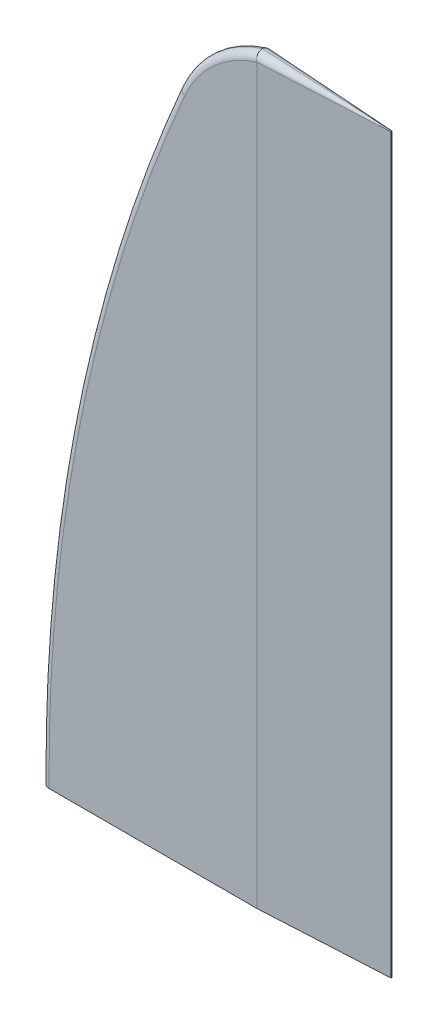
ISO-10303-21;
HEADER;
FILE_DESCRIPTION(('STEP AP214'),'2;1');
FILE_NAME('part.step','',(''),(''),'','','');
FILE_SCHEMA(('AUTOMOTIVE_DESIGN { 1 0 10303 214 1 1 1 1 }'));
ENDSEC;
DATA;
#1=APPLICATION_CONTEXT('core data for automotive mechanical design processes');
#2=APPLICATION_PROTOCOL_DEFINITION('international standard','automotive_design',2000,#1);
#3=PRODUCT_CONTEXT('',#1,'mechanical');
#4=PRODUCT('Part','Part','',(#3));
#5=PRODUCT_RELATED_PRODUCT_CATEGORY('part','',(#4));
#6=PRODUCT_DEFINITION_FORMATION('','',#4);
#7=PRODUCT_DEFINITION_CONTEXT('part definition',#1,'design');
#8=PRODUCT_DEFINITION('design','',#6,#7);
#9=PRODUCT_DEFINITION_SHAPE('','',#8);
#10=(LENGTH_UNIT() NAMED_UNIT(*) SI_UNIT(.MILLI.,.METRE.));
#11=(NAMED_UNIT(*) PLANE_ANGLE_UNIT() SI_UNIT($,.RADIAN.));
#12=(NAMED_UNIT(*) SI_UNIT($,.STERADIAN.) SOLID_ANGLE_UNIT());
#13=UNCERTAINTY_MEASURE_WITH_UNIT(LENGTH_MEASURE(1.E-05),#10,'distance_accuracy_value','');
#14=(GEOMETRIC_REPRESENTATION_CONTEXT(3) GLOBAL_UNCERTAINTY_ASSIGNED_CONTEXT((#13)) GLOBAL_UNIT_ASSIGNED_CONTEXT((#10,
#11,#12)) REPRESENTATION_CONTEXT('',''));
#15=CARTESIAN_POINT('',(0.,0.,0.));
#16=DIRECTION('',(0.,0.,1.));
#17=DIRECTION('',(1.,0.,0.));
#18=AXIS2_PLACEMENT_3D('',#15,#16,#17);
#19=CARTESIAN_POINT('',(-177.8,4.20738999196146E-12,7.62));
#20=DIRECTION('',(0.,1.,0.));
#21=DIRECTION('',(-1.,0.,0.));
#22=AXIS2_PLACEMENT_3D('',#19,#20,#21);
#23=PLANE('',#22);
#24=DIRECTION('',(1.,0.,0.));
#25=VECTOR('',#24,1.);
#26=CARTESIAN_POINT('',(-177.8,4.20738999196146E-12,0.));
#27=LINE('',#26,#25);
#28=CARTESIAN_POINT('',(-173.989872022617,4.11722860658388E-12,0.));
#29=VERTEX_POINT('',#28);
#30=CARTESIAN_POINT('',(-66.0399999999988,1.56274485415709E-12,0.));
#31=VERTEX_POINT('',#30);
#32=EDGE_CURVE('E103',#29,#31,#27,.T.);
#33=ORIENTED_EDGE('',*,*,#32,.T.);
#34=DIRECTION('',(-0.998553440723513,0.,-0.0537682621928045));
#35=VECTOR('',#34,1.);
#36=CARTESIAN_POINT('',(0.,0.,3.556));
#37=LINE('',#36,#35);
#38=CARTESIAN_POINT('',(0.,0.,3.556));
#39=VERTEX_POINT('',#38);
#40=EDGE_CURVE('E336',#31,#39,#37,.F.);
#41=ORIENTED_EDGE('',*,*,#40,.T.);
#42=DIRECTION('',(0.,0.,-1.));
#43=VECTOR('',#42,1.);
#44=CARTESIAN_POINT('',(0.,0.,7.62));
#45=LINE('',#44,#43);
#46=CARTESIAN_POINT('',(0.,0.,4.064));
#47=VERTEX_POINT('',#46);
#48=EDGE_CURVE('E318',#47,#39,#45,.T.);
#49=ORIENTED_EDGE('',*,*,#48,.F.);
#50=DIRECTION('',(-0.998553440723513,0.,0.0537682621928011));
#51=VECTOR('',#50,1.);
#52=CARTESIAN_POINT('',(-66.0400000000044,1.56211849011711E-12,7.62000000000001));
#53=LINE('',#52,#51);
#54=CARTESIAN_POINT('',(-66.0400000000134,1.56243167213738E-12,7.62000000000025));
#55=VERTEX_POINT('',#54);
#56=EDGE_CURVE('E333',#47,#55,#53,.T.);
#57=ORIENTED_EDGE('',*,*,#56,.T.);
#58=DIRECTION('',(1.,0.,0.));
#59=VECTOR('',#58,1.);
#60=CARTESIAN_POINT('',(-177.8,4.20738999196146E-12,7.62));
#61=LINE('',#60,#59);
#62=CARTESIAN_POINT('',(-173.989872022617,4.11722860658388E-12,7.62));
#63=VERTEX_POINT('',#62);
#64=EDGE_CURVE('E121',#63,#55,#61,.T.);
#65=ORIENTED_EDGE('',*,*,#64,.F.);
#66=CARTESIAN_POINT('',(-173.989872022617,4.11722860658388E-12,7.62));
#67=CARTESIAN_POINT('',(-174.097040658265,4.11976460291577E-12,7.62001026615399));
#68=CARTESIAN_POINT('',(-174.204204427978,4.12230048486555E-12,7.61547864249526));
#69=CARTESIAN_POINT('',(-174.417765249125,4.12735410569268E-12,7.59741106169239));
#70=CARTESIAN_POINT('',(-174.524162337038,4.12987184543324E-12,7.58387553585032));
#71=CARTESIAN_POINT('',(-174.735363523923,4.1348696280182E-12,7.54789316023985));
#72=CARTESIAN_POINT('',(-174.840168764086,4.1373496978681E-12,7.52545304083811));
#73=CARTESIAN_POINT('',(-175.047490781595,4.14225568500493E-12,7.47184346879641));
#74=CARTESIAN_POINT('',(-175.150007586889,4.14468160295324E-12,7.44067412283213));
#75=CARTESIAN_POINT('',(-175.453136235242,4.15185472143043E-12,7.33432396086146));
#76=CARTESIAN_POINT('',(-175.649412210338,4.15649931928596E-12,7.24628630802611));
#77=CARTESIAN_POINT('',(-176.024253328145,4.16536941347525E-12,7.03856648156611));
#78=CARTESIAN_POINT('',(-176.202821588502,4.16959498358366E-12,6.91888989199072));
#79=CARTESIAN_POINT('',(-176.537358105811,4.1775113258007E-12,6.65125105655382));
#80=CARTESIAN_POINT('',(-176.693326923372,4.18120211117537E-12,6.50328951254977));
#81=CARTESIAN_POINT('',(-176.978232650241,4.18794400940157E-12,6.18324922107158));
#82=CARTESIAN_POINT('',(-177.107164267177,4.19099499701647E-12,6.01116576285436));
#83=CARTESIAN_POINT('',(-177.33432125276,4.19637035119797E-12,5.64778260319904));
#84=CARTESIAN_POINT('',(-177.43254158394,4.19869459855986E-12,5.45647975606326));
#85=CARTESIAN_POINT('',(-177.595418517781,4.20254885450703E-12,5.06013701910691));
#86=CARTESIAN_POINT('',(-177.66009479702,4.20407932871107E-12,4.85510526240133));
#87=CARTESIAN_POINT('',(-177.737970735452,4.20592215623683E-12,4.50901509655985));
#88=CARTESIAN_POINT('',(-177.761217655541,4.20647226341714E-12,4.37013431403391));
#89=CARTESIAN_POINT('',(-177.792230251385,4.20720613419933E-12,4.09085509775485));
#90=CARTESIAN_POINT('',(-177.800017872046,4.20739041709898E-12,3.95045910014947));
#91=CARTESIAN_POINT('',(-177.8,4.20738999196146E-12,3.80999999999998));
#92=B_SPLINE_CURVE_WITH_KNOTS('',3,(#66,#67,#68,#69,#70,#71,#72,#73,#74,#75,#76,#77,#78,#79,#80,
#81,#82,#83,#84,#85,#86,#87,#88,#89,#90,#91),.UNSPECIFIED.,.F.,.F.,(4,2,2,2,2,2,2,2,2,2,2,2,4),
(0.,0.321401354796179,0.642787315035536,0.963930823125715,1.28507040684692,1.92709141648925,
2.56899918950943,3.21089103641919,3.85290841280215,4.49503104190702,5.13677658157781,
5.5584142509204,5.97945296461459),.UNSPECIFIED.);
#93=CARTESIAN_POINT('',(-177.8,4.58747623222067E-12,3.81));
#94=VERTEX_POINT('',#93);
#95=EDGE_CURVE('E107',#63,#94,#92,.T.);
#96=ORIENTED_EDGE('',*,*,#95,.T.);
#97=CARTESIAN_POINT('',(-177.8,4.58747623222067E-12,3.81));
#98=CARTESIAN_POINT('',(-177.800010270362,4.34389662516994E-12,3.70284019588339));
#99=CARTESIAN_POINT('',(-177.79547893166,4.24386223094728E-12,3.59568525983606));
#100=CARTESIAN_POINT('',(-177.777412514591,4.17027802432819E-12,3.38214208327815));
#101=CARTESIAN_POINT('',(-177.763877868714,4.196722136703E-12,3.27575380618796));
#102=CARTESIAN_POINT('',(-177.727897912471,4.21548945727429E-12,3.06457035707323));
#103=CARTESIAN_POINT('',(-177.705459348967,4.20783845592059E-12,2.95977404103903));
#104=CARTESIAN_POINT('',(-177.651853600446,4.20119870856618E-12,2.752469714012));
#105=CARTESIAN_POINT('',(-177.620686521871,4.20220985693843E-12,2.64996167513101));
#106=CARTESIAN_POINT('',(-177.514344382581,4.2025034555125E-12,2.34685912274692));
#107=CARTESIAN_POINT('',(-177.426313681498,4.19904907897616E-12,2.15060013572));
#108=CARTESIAN_POINT('',(-177.218611433984,4.19313046828321E-12,1.77579089396418));
#109=CARTESIAN_POINT('',(-177.098945453793,4.19066606013332E-12,1.59723753151644));
#110=CARTESIAN_POINT('',(-176.831327857749,4.18460216204715E-12,1.26272230043623));
#111=CARTESIAN_POINT('',(-176.683376099296,4.18100266638832E-12,1.10676054570542));
#112=CARTESIAN_POINT('',(-176.363357935547,4.1733578186659E-12,0.821865302954484));
#113=CARTESIAN_POINT('',(-176.191286817015,4.16931237949224E-12,0.692937109962573));
#114=CARTESIAN_POINT('',(-175.827918872688,4.16073308387637E-12,0.465774469146984));
#115=CARTESIAN_POINT('',(-175.636617687286,4.15619911666421E-12,0.367547002253029));
#116=CARTESIAN_POINT('',(-175.240277676309,4.14681515854244E-12,0.20465336212505));
#117=CARTESIAN_POINT('',(-175.035246970846,4.14196535447547E-12,0.139967545731322));
#118=CARTESIAN_POINT('',(-174.68911391424,4.13377558753369E-12,0.0620635394171811));
#119=CARTESIAN_POINT('',(-174.550188540623,4.13048791506955E-12,0.0388037746668039));
#120=CARTESIAN_POINT('',(-174.270818857961,4.12387662733918E-12,0.00777403518138521));
#121=CARTESIAN_POINT('',(-174.130376986876,4.12055306976329E-12,-1.78957540668996E-05));
#122=CARTESIAN_POINT('',(-173.989872022617,4.11722860658388E-12,0.));
#123=B_SPLINE_CURVE_WITH_KNOTS('',3,(#97,#98,#99,#100,#101,#102,#103,#104,#105,#106,#107,#108,
#109,#110,#111,#112,#113,#114,#115,#116,#117,#118,#119,#120,#121,#122),.UNSPECIFIED.,.F.,.F.,(4,
2,2,2,2,2,2,2,2,2,2,2,4),(0.,0.321374861150199,0.642734285636567,0.963850666595968,
1.28496313183881,1.92692948895154,2.56878296693516,3.21063968088234,3.85262199726322,
4.49475018571196,5.13650189558078,5.5582771813511,5.97945333839844),.UNSPECIFIED.);
#124=EDGE_CURVE('E101',#94,#29,#123,.T.);
#125=ORIENTED_EDGE('',*,*,#124,.T.);
#126=EDGE_LOOP('',(#33,#41,#49,#57,#65,#96,#125));
#127=FACE_BOUND('',#126,.T.);
#128=ADVANCED_FACE('F33',(#127),#23,.F.);
#129=CARTESIAN_POINT('',(0.,0.,7.62));
#130=DIRECTION('',(-1.,0.,0.));
#131=DIRECTION('',(0.,0.,1.));
#132=AXIS2_PLACEMENT_3D('',#129,#130,#131);
#133=PLANE('',#132);
#134=ORIENTED_EDGE('',*,*,#48,.T.);
#135=DIRECTION('',(0.,1.,0.));
#136=VECTOR('',#135,1.);
#137=CARTESIAN_POINT('',(0.,0.,3.556));
#138=LINE('',#137,#136);
#139=CARTESIAN_POINT('',(0.,380.673864339123,3.556));
#140=VERTEX_POINT('',#139);
#141=EDGE_CURVE('E275',#39,#140,#138,.T.);
#142=ORIENTED_EDGE('',*,*,#141,.T.);
#143=CARTESIAN_POINT('',(-5.87016179554537E-08,380.940339873911,3.81));
#144=CARTESIAN_POINT('',(-5.87016043855815E-08,380.940336035945,3.79296989406645));
#145=CARTESIAN_POINT('',(-5.86953716410879E-08,380.938559317114,3.77612475351803));
#146=CARTESIAN_POINT('',(-5.86766867696943E-08,380.933234310612,3.75110450372823));
#147=CARTESIAN_POINT('',(-5.86688369849191E-08,380.930997333708,3.74277995796682));
#148=CARTESIAN_POINT('',(-5.86501980588926E-08,380.92568647199,3.72648927831585));
#149=CARTESIAN_POINT('',(-5.86394113170854E-08,380.922613269396,3.71850240749036));
#150=CARTESIAN_POINT('',(-5.86148965002879E-08,380.915630070262,3.70283213963602));
#151=CARTESIAN_POINT('',(-5.8601163388229E-08,380.911718652784,3.69516099037899));
#152=CARTESIAN_POINT('',(-5.85713486131657E-08,380.903228659608,3.68041703896696));
#153=CARTESIAN_POINT('',(-5.85551814380839E-08,380.898625723158,3.67328773109757));
#154=CARTESIAN_POINT('',(-5.85204487303313E-08,380.888739344598,3.65953534882159));
#155=CARTESIAN_POINT('',(-5.85018561466144E-08,380.883448203632,3.65290178549882));
#156=CARTESIAN_POINT('',(-5.8462320253115E-08,380.872199915129,3.6401481918499));
#157=CARTESIAN_POINT('',(-5.84412028737055E-08,380.866193270581,3.63398309289698));
#158=CARTESIAN_POINT('',(-5.83970898129149E-08,380.853649401048,3.6223235009385));
#159=CARTESIAN_POINT('',(-5.83742095898325E-08,380.847144984121,3.61684910313877));
#160=CARTESIAN_POINT('',(-5.83267490595722E-08,380.833657035909,3.60655750179924));
#161=CARTESIAN_POINT('',(-5.83021878538732E-08,380.826678933001,3.60174486333879));
#162=CARTESIAN_POINT('',(-5.82514179999615E-08,380.812259443856,3.59277883245247));
#163=CARTESIAN_POINT('',(-5.82252384514195E-08,380.804826315636,3.58862961174891));
#164=CARTESIAN_POINT('',(-5.81710832362427E-08,380.78945549972,3.58098546081174));
#165=CARTESIAN_POINT('',(-5.8143457155318E-08,380.781617046348,3.57754096358247));
#166=CARTESIAN_POINT('',(-5.80595818004703E-08,380.757827387366,3.56838809296258));
#167=CARTESIAN_POINT('',(-5.80020102555713E-08,380.741509464688,3.56378282488942));
#168=CARTESIAN_POINT('',(-5.79132522021404E-08,380.71637134047,3.55911747283134));
#169=CARTESIAN_POINT('',(-5.78831215997539E-08,380.707840921527,3.55794007963109));
#170=CARTESIAN_POINT('',(-5.78230057990156E-08,380.690827754856,3.55638482960896));
#171=CARTESIAN_POINT('',(-5.77929986649572E-08,380.682338748479,3.55600019338399));
#172=CARTESIAN_POINT('',(-5.77630318243774E-08,380.673864339124,3.55599999688112));
#173=B_SPLINE_CURVE_WITH_KNOTS('',3,(#143,#144,#145,#146,#147,#148,#149,#150,#151,#152,#153,
#154,#155,#156,#157,#158,#159,#160,#161,#162,#163,#164,#165,#166,#167,#168,#169,#170,#171,#172),
.UNSPECIFIED.,.F.,.F.,(4,2,2,2,2,2,2,2,2,2,2,2,2,2,4),(-0.000904666979090886,
-0.00085380254454973,-0.000828370327279152,-0.000802938110008575,-0.000777505892737997,
-0.000752073675467419,-0.000726641458196842,-0.000701209240926264,-0.000675777023655686,
-0.000650344806385108,-0.000624912589114531,-0.000599480371843953,-0.000548615937302798,
-0.00052318372003222,-0.000497751502761642),.UNSPECIFIED.);
#174=CARTESIAN_POINT('',(0.,380.940339870946,3.81));
#175=VERTEX_POINT('',#174);
#176=EDGE_CURVE('E274',#140,#175,#173,.F.);
#177=ORIENTED_EDGE('',*,*,#176,.T.);
#178=CARTESIAN_POINT('',(-7.62700042988641E-08,380.673864339117,4.06400000414237));
#179=CARTESIAN_POINT('',(-7.63491224536287E-08,380.690809311385,4.06399689298982));
#180=CARTESIAN_POINT('',(-7.64279846784333E-08,380.707712238314,4.06247649352148));
#181=CARTESIAN_POINT('',(-7.65854857106903E-08,380.741495541907,4.05623268244644));
#182=CARTESIAN_POINT('',(-7.66617065933206E-08,380.757857303827,4.05160155557711));
#183=CARTESIAN_POINT('',(-7.67719974752262E-08,380.781548652059,4.04248478391147));
#184=CARTESIAN_POINT('',(-7.68081596548586E-08,380.789319363921,4.03907336297091));
#185=CARTESIAN_POINT('',(-7.68790265191935E-08,380.804552635266,4.03151515536221));
#186=CARTESIAN_POINT('',(-7.69139922696762E-08,380.812071354893,4.02733317842893));
#187=CARTESIAN_POINT('',(-7.69816472328649E-08,380.826623884173,4.01829422114413));
#188=CARTESIAN_POINT('',(-7.70141543643288E-08,380.833618481648,4.01346962251403));
#189=CARTESIAN_POINT('',(-7.7076762565409E-08,380.847093835736,4.0031922047913));
#190=CARTESIAN_POINT('',(-7.71068320484533E-08,380.853567797506,3.99774408846721));
#191=CARTESIAN_POINT('',(-7.71644761975933E-08,380.865981862219,3.98622149877996));
#192=CARTESIAN_POINT('',(-7.71920450522436E-08,380.871920716624,3.98014763166807));
#193=CARTESIAN_POINT('',(-7.72446135943315E-08,380.883247683705,3.96734544795865));
#194=CARTESIAN_POINT('',(-7.72696201683941E-08,380.888637302385,3.96060244620191));
#195=CARTESIAN_POINT('',(-7.73159039265092E-08,380.898614830388,3.94673151127312));
#196=CARTESIAN_POINT('',(-7.73374144351635E-08,380.903253014432,3.9395458802217));
#197=CARTESIAN_POINT('',(-7.73769213778477E-08,380.911773139276,3.92473910010849));
#198=CARTESIAN_POINT('',(-7.73950622803914E-08,380.915686243262,3.91705120296153));
#199=CARTESIAN_POINT('',(-7.7427323017559E-08,380.92264604519,3.90141456786995));
#200=CARTESIAN_POINT('',(-7.74414580898035E-08,380.925696015502,3.89347819030483));
#201=CARTESIAN_POINT('',(-7.74658321400736E-08,380.930955798928,3.87735070583355));
#202=CARTESIAN_POINT('',(-7.7476067115818E-08,380.933164749046,3.86916180434962));
#203=CARTESIAN_POINT('',(-7.74925747700241E-08,380.936727706336,3.85253949009953));
#204=CARTESIAN_POINT('',(-7.74988593369913E-08,380.93808427984,3.84408274679556));
#205=CARTESIAN_POINT('',(-7.75072514421961E-08,380.939895821099,3.82698926911412));
#206=CARTESIAN_POINT('',(-7.75093072324921E-08,380.940339617895,3.8184881234041));
#207=CARTESIAN_POINT('',(-7.75093084319734E-08,380.940339874865,3.81000000000042));
#208=B_SPLINE_CURVE_WITH_KNOTS('',3,(#178,#179,#180,#181,#182,#183,#184,#185,#186,#187,#188,
#189,#190,#191,#192,#193,#194,#195,#196,#197,#198,#199,#200,#201,#202,#203,#204,#205,#206,#207),
.UNSPECIFIED.,.F.,.F.,(4,2,2,2,2,2,2,2,2,2,2,2,2,2,4),(0.000547637598369444,
0.000598422191249404,0.000649206784129365,0.000674599080569345,0.000699991377009325,
0.000725383673449306,0.000750775969889286,0.000776168266329266,0.000801560562769247,
0.000826952859209227,0.000852345155649207,0.000877737452089188,0.000903129748529168,
0.000928522044969148,0.000953914341409128),.UNSPECIFIED.);
#209=CARTESIAN_POINT('',(0.,380.673864339117,4.064));
#210=VERTEX_POINT('',#209);
#211=EDGE_CURVE('E271',#175,#210,#208,.F.);
#212=ORIENTED_EDGE('',*,*,#211,.T.);
#213=DIRECTION('',(0.,-1.,0.));
#214=VECTOR('',#213,1.);
#215=CARTESIAN_POINT('',(0.,0.,4.064));
#216=LINE('',#215,#214);
#217=EDGE_CURVE('E142',#210,#47,#216,.T.);
#218=ORIENTED_EDGE('',*,*,#217,.T.);
#219=EDGE_LOOP('',(#134,#142,#177,#212,#218));
#220=FACE_BOUND('',#219,.T.);
#221=ADVANCED_FACE('F292',(#220),#133,.F.);
#222=CARTESIAN_POINT('',(679.954878347523,7.01486398581396,7.62));
#223=DIRECTION('',(0.,0.,1.));
#224=DIRECTION('',(1.,0.,0.));
#225=AXIS2_PLACEMENT_3D('',#222,#223,#224);
#226=PLANE('',#225);
#227=ORIENTED_EDGE('',*,*,#64,.T.);
#228=DIRECTION('',(0.,1.,0.));
#229=VECTOR('',#228,1.);
#230=CARTESIAN_POINT('',(-66.0400000000042,383.54,7.62));
#231=LINE('',#230,#229);
#232=CARTESIAN_POINT('',(-66.0400000000042,380.673864339122,7.62));
#233=VERTEX_POINT('',#232);
#234=EDGE_CURVE('E11',#55,#233,#231,.T.);
#235=ORIENTED_EDGE('',*,*,#234,.T.);
#236=CARTESIAN_POINT('',(-47.5677363015026,322.579999999994,7.62));
#237=DIRECTION('',(0.,0.,1.));
#238=DIRECTION('',(1.,0.,0.));
#239=AXIS2_PLACEMENT_3D('',#236,#237,#238);
#240=CIRCLE('',#239,60.96);
#241=CARTESIAN_POINT('',(-103.493360655067,346.837908827096,7.62));
#242=VERTEX_POINT('',#241);
#243=EDGE_CURVE('E130',#233,#242,#240,.T.);
#244=ORIENTED_EDGE('',*,*,#243,.T.);
#245=CARTESIAN_POINT('',(679.954878347523,7.01486398581396,7.62));
#246=DIRECTION('',(0.,0.,1.));
#247=DIRECTION('',(1.,0.,0.));
#248=AXIS2_PLACEMENT_3D('',#245,#246,#247);
#249=CIRCLE('',#248,853.973562238);
#250=EDGE_CURVE('E128',#242,#63,#249,.T.);
#251=ORIENTED_EDGE('',*,*,#250,.T.);
#252=EDGE_LOOP('',(#227,#235,#244,#251));
#253=FACE_BOUND('',#252,.T.);
#254=ADVANCED_FACE('F302',(#253),#226,.T.);
#255=CARTESIAN_POINT('',(679.954878347523,7.01486398581396,0.));
#256=DIRECTION('',(0.,0.,1.));
#257=DIRECTION('',(1.,0.,0.));
#258=AXIS2_PLACEMENT_3D('',#255,#256,#257);
#259=PLANE('',#258);
#260=CARTESIAN_POINT('',(-47.5677363015026,322.579999999994,0.));
#261=DIRECTION('',(0.,0.,1.));
#262=DIRECTION('',(1.,0.,0.));
#263=AXIS2_PLACEMENT_3D('',#260,#261,#262);
#264=CIRCLE('',#263,60.96);
#265=CARTESIAN_POINT('',(-103.493360655067,346.837908827096,0.));
#266=VERTEX_POINT('',#265);
#267=CARTESIAN_POINT('',(-66.0400000000035,380.673864339122,0.));
#268=VERTEX_POINT('',#267);
#269=EDGE_CURVE('E112',#266,#268,#264,.F.);
#270=ORIENTED_EDGE('',*,*,#269,.T.);
#271=DIRECTION('',(0.,-1.,0.));
#272=VECTOR('',#271,1.);
#273=CARTESIAN_POINT('',(-66.04,7.01486398581396,0.));
#274=LINE('',#273,#272);
#275=EDGE_CURVE('E120',#268,#31,#274,.T.);
#276=ORIENTED_EDGE('',*,*,#275,.T.);
#277=ORIENTED_EDGE('',*,*,#32,.F.);
#278=CARTESIAN_POINT('',(679.954878347523,7.01486398581396,0.));
#279=DIRECTION('',(0.,0.,1.));
#280=DIRECTION('',(1.,0.,0.));
#281=AXIS2_PLACEMENT_3D('',#278,#279,#280);
#282=CIRCLE('',#281,853.973562238);
#283=EDGE_CURVE('E118',#29,#266,#282,.F.);
#284=ORIENTED_EDGE('',*,*,#283,.T.);
#285=EDGE_LOOP('',(#270,#276,#277,#284));
#286=FACE_BOUND('',#285,.T.);
#287=ADVANCED_FACE('F117',(#286),#259,.F.);
#288=CARTESIAN_POINT('',(-47.5677363015026,322.579999999994,3.81));
#289=DIRECTION('',(0.,0.,1.));
#290=DIRECTION('',(1.,0.,0.));
#291=AXIS2_PLACEMENT_3D('',#288,#289,#290);
#292=TOROIDAL_SURFACE('',#291,60.96,3.81);
#293=ORIENTED_EDGE('',*,*,#243,.F.);
#294=CARTESIAN_POINT('',(-67.1130775592532,384.33056708337,3.81000000000636));
#295=CARTESIAN_POINT('',(-67.1130765206571,384.330563559126,3.93732184900285));
#296=CARTESIAN_POINT('',(-67.1112964713744,384.324470021786,4.06483903259373));
#297=CARTESIAN_POINT('',(-67.1040299905085,384.29959694889,4.32124119366493));
#298=CARTESIAN_POINT('',(-67.0985883659693,384.280970795271,4.4480923411765));
#299=CARTESIAN_POINT('',(-67.0842948662452,384.232051045421,4.69742705089509));
#300=CARTESIAN_POINT('',(-67.0754326971475,384.201722212472,4.82026057117223));
#301=CARTESIAN_POINT('',(-67.0543279128782,384.129506941874,5.06217283432295));
#302=CARTESIAN_POINT('',(-67.0420887631659,384.087632351513,5.1812184958844));
#303=CARTESIAN_POINT('',(-67.0141551251063,383.992080109961,5.41576801845425));
#304=CARTESIAN_POINT('',(-66.9984474429446,383.938357561791,5.53108647381079));
#305=CARTESIAN_POINT('',(-66.9642395253744,383.821389305241,5.75318817189583));
#306=CARTESIAN_POINT('',(-66.9456141988635,383.757715760161,5.86097263594111));
#307=CARTESIAN_POINT('',(-66.9055384330647,383.620747815077,6.06903665649691));
#308=CARTESIAN_POINT('',(-66.8838859647609,383.546763309316,6.17018168120978));
#309=CARTESIAN_POINT('',(-66.8383683865241,383.391281579179,6.36221443376397));
#310=CARTESIAN_POINT('',(-66.8144973136617,383.309763637762,6.45332243896008));
#311=CARTESIAN_POINT('',(-66.7645849142653,383.139372823858,6.62616128147435));
#312=CARTESIAN_POINT('',(-66.7385486196935,383.050517082275,6.70788302501401));
#313=CARTESIAN_POINT('',(-66.6843379914784,382.865575014786,6.86204428836354));
#314=CARTESIAN_POINT('',(-66.656191007733,382.769581937173,6.93441326664343));
#315=CARTESIAN_POINT('',(-66.5976105343597,382.569874458193,7.06999762372503));
#316=CARTESIAN_POINT('',(-66.5673347036063,382.466698268076,7.13272727670531));
#317=CARTESIAN_POINT('',(-66.5059731380454,382.257669263229,7.24610038901025));
#318=CARTESIAN_POINT('',(-66.4746613539392,382.15104574062,7.29727170227273));
#319=CARTESIAN_POINT('',(-66.3791636732624,381.825989119177,7.43402327508974));
#320=CARTESIAN_POINT('',(-66.3131662183091,381.601520324452,7.50349017705246));
#321=CARTESIAN_POINT('',(-66.1767906356239,381.138096646798,7.5971473415144));
#322=CARTESIAN_POINT('',(-66.1085061189738,380.906255842689,7.61995333385984));
#323=CARTESIAN_POINT('',(-66.0399999999828,380.673864339049,7.62000000003552));
#324=B_SPLINE_CURVE_WITH_KNOTS('',3,(#294,#295,#296,#297,#298,#299,#300,#301,#302,#303,#304,
#305,#306,#307,#308,#309,#310,#311,#312,#313,#314,#315,#316,#317,#318,#319,#320,#321,#322,#323),
.UNSPECIFIED.,.F.,.F.,(4,2,2,2,2,2,2,2,2,2,2,2,2,2,4),(0.000547637598369444,
0.000573029894809424,0.000598422191249404,0.000623814487689385,0.000649206784129365,
0.000674599080569345,0.000699991377009325,0.000725383673449306,0.000750775969889286,
0.000776168266329266,0.000801560562769247,0.000826952859209227,0.000852345155649207,
0.000903129748529168,0.000953914341409129),.UNSPECIFIED.);
#325=CARTESIAN_POINT('',(-67.1130775592523,384.330567083367,3.81));
#326=VERTEX_POINT('',#325);
#327=EDGE_CURVE('E44',#233,#326,#324,.F.);
#328=ORIENTED_EDGE('',*,*,#327,.T.);
#329=CARTESIAN_POINT('',(-47.5677363015026,322.579999999994,3.81));
#330=DIRECTION('',(0.,0.,1.));
#331=DIRECTION('',(1.,0.,0.));
#332=AXIS2_PLACEMENT_3D('',#329,#330,#331);
#333=CIRCLE('',#332,64.77);
#334=CARTESIAN_POINT('',(-106.988712177165,348.354028128789,3.81));
#335=VERTEX_POINT('',#334);
#336=EDGE_CURVE('E122',#335,#326,#333,.F.);
#337=ORIENTED_EDGE('',*,*,#336,.F.);
#338=CARTESIAN_POINT('',(-103.493360655067,346.837908827096,3.81));
#339=DIRECTION('',(-0.397931575247737,-0.91741509766346,0.));
#340=DIRECTION('',(0.91741509766346,-0.397931575247737,0.));
#341=AXIS2_PLACEMENT_3D('',#338,#339,#340);
#342=CIRCLE('',#341,3.81);
#343=EDGE_CURVE('E331',#242,#335,#342,.T.);
#344=ORIENTED_EDGE('',*,*,#343,.F.);
#345=EDGE_LOOP('',(#293,#328,#337,#344));
#346=FACE_BOUND('',#345,.T.);
#347=ADVANCED_FACE('F152',(#346),#292,.T.);
#348=CARTESIAN_POINT('',(-47.5677363015026,322.579999999994,3.81));
#349=DIRECTION('',(0.,0.,1.));
#350=DIRECTION('',(1.,0.,0.));
#351=AXIS2_PLACEMENT_3D('',#348,#349,#350);
#352=TOROIDAL_SURFACE('',#351,60.96,3.81);
#353=ORIENTED_EDGE('',*,*,#336,.T.);
#354=CARTESIAN_POINT('',(-66.0400000000142,380.673864339156,-8.56563084350448E-12));
#355=CARTESIAN_POINT('',(-66.0742608345639,380.790086467546,2.94726647458678E-06));
#356=CARTESIAN_POINT('',(-66.1085677363058,380.906515290247,0.00577249061354379));
#357=CARTESIAN_POINT('',(-66.1772976211743,381.139868128861,0.0291012408697524));
#358=CARTESIAN_POINT('',(-66.211745683208,381.256878091259,0.0467621385365243));
#359=CARTESIAN_POINT('',(-66.3132220125346,381.601711519288,0.116742418598129));
#360=CARTESIAN_POINT('',(-66.3790430712913,381.825578661018,0.185821438639038));
#361=CARTESIAN_POINT('',(-66.4749370527601,382.151984145399,0.323114496524675));
#362=CARTESIAN_POINT('',(-66.5065217166587,382.259537204443,0.374781954241089));
#363=CARTESIAN_POINT('',(-66.5684369146336,382.470453787014,0.489444216895394));
#364=CARTESIAN_POINT('',(-66.5983677703337,382.572455604365,0.551682526685335));
#365=CARTESIAN_POINT('',(-66.6564125135008,382.770337437952,0.686172988334919));
#366=CARTESIAN_POINT('',(-66.6844931315612,382.866104141267,0.758362564356306));
#367=CARTESIAN_POINT('',(-66.738754353079,383.05121909331,0.912736582560337));
#368=CARTESIAN_POINT('',(-66.7649131179778,383.140492840701,0.994852548549467));
#369=CARTESIAN_POINT('',(-66.815347206056,383.312665412329,1.1697464257858));
#370=CARTESIAN_POINT('',(-66.8394905267424,383.395113972137,1.26222290894927));
#371=CARTESIAN_POINT('',(-66.8846915782963,383.549515884734,1.4535268113361));
#372=CARTESIAN_POINT('',(-66.9059483214915,383.622148613513,1.55303025996211));
#373=CARTESIAN_POINT('',(-66.9456579315389,383.757865314461,1.75931599157373));
#374=CARTESIAN_POINT('',(-66.9641417256226,383.821054971821,1.86625560831424));
#375=CARTESIAN_POINT('',(-66.9982287049576,383.937609547704,2.08741487677042));
#376=CARTESIAN_POINT('',(-67.0139296554416,383.991308923109,2.20248211422851));
#377=CARTESIAN_POINT('',(-67.0419572374644,384.087182370226,2.43753612915774));
#378=CARTESIAN_POINT('',(-67.0542896278411,384.129375922338,2.55733919009522));
#379=CARTESIAN_POINT('',(-67.0755993538057,384.202292487592,2.80169938183132));
#380=CARTESIAN_POINT('',(-67.0845739461294,384.233006137015,2.92656756674349));
#381=CARTESIAN_POINT('',(-67.1059362010422,384.306119018901,3.30187130898849));
#382=CARTESIAN_POINT('',(-67.1130620449336,384.330514446494,3.5545484141249));
#383=CARTESIAN_POINT('',(-67.1130775592533,384.330567083366,3.81000000000003));
#384=B_SPLINE_CURVE_WITH_KNOTS('',3,(#354,#355,#356,#357,#358,#359,#360,#361,#362,#363,#364,
#365,#366,#367,#368,#369,#370,#371,#372,#373,#374,#375,#376,#377,#378,#379,#380,#381,#382,#383),
.UNSPECIFIED.,.F.,.F.,(4,2,2,2,2,2,2,2,2,2,2,2,2,2,4),(-0.000904666979090886,
-0.000879234761820308,-0.00085380254454973,-0.000802938110008575,-0.000777505892737997,
-0.000752073675467419,-0.000726641458196842,-0.000701209240926264,-0.000675777023655686,
-0.000650344806385108,-0.000624912589114531,-0.000599480371843953,-0.000574048154573375,
-0.000548615937302798,-0.000497751502761642),.UNSPECIFIED.);
#385=EDGE_CURVE('E199',#326,#268,#384,.F.);
#386=ORIENTED_EDGE('',*,*,#385,.T.);
#387=ORIENTED_EDGE('',*,*,#269,.F.);
#388=CARTESIAN_POINT('',(-103.493360655067,346.837908827096,3.81));
#389=DIRECTION('',(-0.397931575247735,-0.91741509766346,0.));
#390=DIRECTION('',(0.91741509766346,-0.397931575247735,0.));
#391=AXIS2_PLACEMENT_3D('',#388,#389,#390);
#392=CIRCLE('',#391,3.81);
#393=EDGE_CURVE('E126',#335,#266,#392,.T.);
#394=ORIENTED_EDGE('',*,*,#393,.F.);
#395=EDGE_LOOP('',(#353,#386,#387,#394));
#396=FACE_BOUND('',#395,.T.);
#397=ADVANCED_FACE('F161',(#396),#352,.T.);
#398=CARTESIAN_POINT('',(679.954878347523,7.01486398581396,3.81));
#399=DIRECTION('',(0.,0.,1.));
#400=DIRECTION('',(1.,0.,0.));
#401=AXIS2_PLACEMENT_3D('',#398,#399,#400);
#402=TOROIDAL_SURFACE('',#401,853.973562238,3.81);
#403=ORIENTED_EDGE('',*,*,#250,.F.);
#404=ORIENTED_EDGE('',*,*,#343,.T.);
#405=CARTESIAN_POINT('',(679.954878347523,7.01486398581396,3.81));
#406=DIRECTION('',(0.,0.,1.));
#407=DIRECTION('',(1.,0.,0.));
#408=AXIS2_PLACEMENT_3D('',#405,#406,#407);
#409=CIRCLE('',#408,857.783562238);
#410=EDGE_CURVE('E138',#94,#335,#409,.F.);
#411=ORIENTED_EDGE('',*,*,#410,.F.);
#412=ORIENTED_EDGE('',*,*,#95,.F.);
#413=EDGE_LOOP('',(#403,#404,#411,#412));
#414=FACE_BOUND('',#413,.T.);
#415=ADVANCED_FACE('F319',(#414),#402,.T.);
#416=CARTESIAN_POINT('',(679.954878347523,7.01486398581396,3.81));
#417=DIRECTION('',(0.,0.,1.));
#418=DIRECTION('',(1.,0.,0.));
#419=AXIS2_PLACEMENT_3D('',#416,#417,#418);
#420=TOROIDAL_SURFACE('',#419,853.973562238,3.81);
#421=ORIENTED_EDGE('',*,*,#393,.T.);
#422=ORIENTED_EDGE('',*,*,#283,.F.);
#423=ORIENTED_EDGE('',*,*,#124,.F.);
#424=ORIENTED_EDGE('',*,*,#410,.T.);
#425=EDGE_LOOP('',(#421,#422,#423,#424));
#426=FACE_BOUND('',#425,.T.);
#427=ADVANCED_FACE('F124',(#426),#420,.T.);
#428=CARTESIAN_POINT('',(-66.0400000000042,7.01486398581396,7.62));
#429=DIRECTION('',(0.0537682621928011,0.,0.998553440723513));
#430=DIRECTION('',(0.,-1.,0.));
#431=AXIS2_PLACEMENT_3D('',#428,#429,#430);
#432=PLANE('',#431);
#433=ORIENTED_EDGE('',*,*,#56,.F.);
#434=ORIENTED_EDGE('',*,*,#217,.F.);
#435=CARTESIAN_POINT('',(-66.0399999999828,380.673864339049,7.62000000003552));
#436=CARTESIAN_POINT('',(0.,380.673864339117,4.06400000003552));
#437=B_SPLINE_CURVE_WITH_KNOTS('',1,(#435,#436),.UNSPECIFIED.,.F.,.F.,(2,2),(0.,1.),.UNSPECIFIED.);
#438=EDGE_CURVE('E263',#233,#210,#437,.T.);
#439=ORIENTED_EDGE('',*,*,#438,.F.);
#440=ORIENTED_EDGE('',*,*,#234,.F.);
#441=EDGE_LOOP('',(#433,#434,#439,#440));
#442=FACE_BOUND('',#441,.T.);
#443=ADVANCED_FACE('F35',(#442),#432,.T.);
#444=CARTESIAN_POINT('',(-66.0399999999828,380.673864339049,7.62000000003552));
#445=CARTESIAN_POINT('',(-66.1085061189738,380.906255842689,7.61995333385984));
#446=CARTESIAN_POINT('',(-66.1767906356239,381.138096646798,7.5971473415144));
#447=CARTESIAN_POINT('',(-66.3131662183091,381.601520324452,7.50349017705246));
#448=CARTESIAN_POINT('',(-66.3791636732624,381.825989119177,7.43402327508974));
#449=CARTESIAN_POINT('',(-66.4746613539392,382.15104574062,7.29727170227273));
#450=CARTESIAN_POINT('',(-66.5059731380454,382.257669263229,7.24610038901025));
#451=CARTESIAN_POINT('',(-66.5673347036063,382.466698268076,7.13272727670531));
#452=CARTESIAN_POINT('',(-66.5976105343597,382.569874458193,7.06999762372503));
#453=CARTESIAN_POINT('',(-66.656191007733,382.769581937173,6.93441326664343));
#454=CARTESIAN_POINT('',(-66.6843379914784,382.865575014786,6.86204428836354));
#455=CARTESIAN_POINT('',(-66.7385486196935,383.050517082275,6.70788302501401));
#456=CARTESIAN_POINT('',(-66.7645849142653,383.139372823858,6.62616128147435));
#457=CARTESIAN_POINT('',(-66.8144973136617,383.309763637762,6.45332243896008));
#458=CARTESIAN_POINT('',(-66.8383683865241,383.391281579179,6.36221443376397));
#459=CARTESIAN_POINT('',(-66.8838859647609,383.546763309316,6.17018168120978));
#460=CARTESIAN_POINT('',(-66.9055384330647,383.620747815077,6.06903665649691));
#461=CARTESIAN_POINT('',(-66.9456141988635,383.757715760161,5.86097263594111));
#462=CARTESIAN_POINT('',(-66.9642395253744,383.821389305241,5.75318817189583));
#463=CARTESIAN_POINT('',(-66.9984474429446,383.938357561791,5.53108647381079));
#464=CARTESIAN_POINT('',(-67.0141551251063,383.992080109961,5.41576801845425));
#465=CARTESIAN_POINT('',(-67.0420887631659,384.087632351513,5.1812184958844));
#466=CARTESIAN_POINT('',(-67.0543279128782,384.129506941874,5.06217283432295));
#467=CARTESIAN_POINT('',(-67.0754326971475,384.201722212472,4.82026057117223));
#468=CARTESIAN_POINT('',(-67.0842948662452,384.232051045421,4.69742705089509));
#469=CARTESIAN_POINT('',(-67.0985883659693,384.280970795271,4.4480923411765));
#470=CARTESIAN_POINT('',(-67.1040299905085,384.29959694889,4.32124119366493));
#471=CARTESIAN_POINT('',(-67.1112964713744,384.324470021786,4.06483903259373));
#472=CARTESIAN_POINT('',(-67.1130765206571,384.330563559126,3.93732184900285));
#473=CARTESIAN_POINT('',(-67.1130775592532,384.33056708337,3.81000000000636));
#474=CARTESIAN_POINT('',(0.,380.673864339117,4.06400000003552));
#475=CARTESIAN_POINT('',(0.,380.690809311136,4.06399688888302));
#476=CARTESIAN_POINT('',(0.,380.707712237817,4.06247648943927));
#477=CARTESIAN_POINT('',(0.,380.741495540913,4.05623267846518));
#478=CARTESIAN_POINT('',(0.,380.757857302594,4.05160155167073));
#479=CARTESIAN_POINT('',(0.,380.781548650477,4.04248478015249));
#480=CARTESIAN_POINT('',(0.,380.789319362225,4.03907335926709));
#481=CARTESIAN_POINT('',(0.,380.804552633347,4.0315151517806));
#482=CARTESIAN_POINT('',(0.,380.812071352863,4.02733317491494));
#483=CARTESIAN_POINT('',(0.,380.826623881929,4.01829421777629));
#484=CARTESIAN_POINT('',(0.,380.833618479301,4.0134696192242));
#485=CARTESIAN_POINT('',(0.,380.847093833192,4.00319220166764));
#486=CARTESIAN_POINT('',(0.,380.853567794866,3.99774408543163));
#487=CARTESIAN_POINT('',(0.,380.865981859396,3.98622149593069));
#488=CARTESIAN_POINT('',(0.,380.871920713714,3.98014762891701));
#489=CARTESIAN_POINT('',(0.,380.883247680629,3.96734544541458));
#490=CARTESIAN_POINT('',(0.,380.88863729923,3.96060244376686));
#491=CARTESIAN_POINT('',(0.,380.898614827086,3.94673150906235));
#492=CARTESIAN_POINT('',(0.,380.903253011062,3.93954587812712));
#493=CARTESIAN_POINT('',(0.,380.91177313578,3.92473909825331));
#494=CARTESIAN_POINT('',(0.,380.915686239709,3.91705120123066));
#495=CARTESIAN_POINT('',(0.,380.922646041535,3.9014145663919));
#496=CARTESIAN_POINT('',(0.,380.925696011802,3.8934781889551));
#497=CARTESIAN_POINT('',(0.,380.93095579515,3.87735070474458));
#498=CARTESIAN_POINT('',(0.,380.933164745236,3.86916180339305));
#499=CARTESIAN_POINT('',(0.,380.936727702474,3.85253948941173));
#500=CARTESIAN_POINT('',(0.,380.938084275957,3.84408274624449));
#501=CARTESIAN_POINT('',(0.,380.93989581719,3.82698926883942));
#502=CARTESIAN_POINT('',(0.,380.94033961398,3.81848812326685));
#503=CARTESIAN_POINT('',(0.,380.940339870949,3.81000000000042));
#504=B_SPLINE_SURFACE_WITH_KNOTS('',1,3,((#444,#445,#446,#447,#448,#449,#450,#451,#452,#453,
#454,#455,#456,#457,#458,#459,#460,#461,#462,#463,#464,#465,#466,#467,#468,#469,#470,#471,#472,
#473),(#474,#475,#476,#477,#478,#479,#480,#481,#482,#483,#484,#485,#486,#487,#488,#489,#490,
#491,#492,#493,#494,#495,#496,#497,#498,#499,#500,#501,#502,#503)),.UNSPECIFIED.,.F.,.F.,.F.,(2,
2),(4,2,2,2,2,2,2,2,2,2,2,2,2,2,4),(0.,1.),(0.000547637598369444,0.000598422191249404,
0.000649206784129365,0.000674599080569345,0.000699991377009325,0.000725383673449306,
0.000750775969889286,0.000776168266329266,0.000801560562769247,0.000826952859209227,
0.000852345155649207,0.000877737452089188,0.000903129748529168,0.000928522044969148,
0.000953914341409128),.UNSPECIFIED.);
#505=CARTESIAN_POINT('',(-67.1130775592533,384.330567083366,3.81000000000003));
#506=CARTESIAN_POINT('',(0.,380.940339870946,3.81));
#507=B_SPLINE_CURVE_WITH_KNOTS('',1,(#505,#506),.UNSPECIFIED.,.F.,.F.,(2,2),(0.,1.),.UNSPECIFIED.);
#508=EDGE_CURVE('E210',#326,#175,#507,.T.);
#509=ORIENTED_EDGE('',*,*,#438,.T.);
#510=ORIENTED_EDGE('',*,*,#211,.F.);
#511=ORIENTED_EDGE('',*,*,#508,.F.);
#512=ORIENTED_EDGE('',*,*,#327,.F.);
#513=EDGE_LOOP('',(#509,#510,#511,#512));
#514=FACE_BOUND('',#513,.T.);
#515=ADVANCED_FACE('F226',(#514),#504,.T.);
#516=CARTESIAN_POINT('',(-67.1130775592533,384.330567083366,3.81000000000003));
#517=CARTESIAN_POINT('',(-67.1130620449336,384.330514446494,3.5545484141249));
#518=CARTESIAN_POINT('',(-67.1059362010422,384.306119018901,3.30187130898849));
#519=CARTESIAN_POINT('',(-67.0845739461294,384.233006137015,2.92656756674349));
#520=CARTESIAN_POINT('',(-67.0755993538057,384.202292487592,2.80169938183132));
#521=CARTESIAN_POINT('',(-67.0542896278411,384.129375922338,2.55733919009522));
#522=CARTESIAN_POINT('',(-67.0419572374644,384.087182370226,2.43753612915774));
#523=CARTESIAN_POINT('',(-67.0139296554416,383.991308923109,2.20248211422851));
#524=CARTESIAN_POINT('',(-66.9982287049576,383.937609547704,2.08741487677042));
#525=CARTESIAN_POINT('',(-66.9641417256226,383.821054971821,1.86625560831424));
#526=CARTESIAN_POINT('',(-66.9456579315389,383.757865314461,1.75931599157373));
#527=CARTESIAN_POINT('',(-66.9059483214915,383.622148613513,1.55303025996211));
#528=CARTESIAN_POINT('',(-66.8846915782963,383.549515884734,1.4535268113361));
#529=CARTESIAN_POINT('',(-66.8394905267424,383.395113972137,1.26222290894927));
#530=CARTESIAN_POINT('',(-66.815347206056,383.312665412329,1.1697464257858));
#531=CARTESIAN_POINT('',(-66.7649131179778,383.140492840701,0.994852548549467));
#532=CARTESIAN_POINT('',(-66.738754353079,383.05121909331,0.912736582560337));
#533=CARTESIAN_POINT('',(-66.6844931315612,382.866104141267,0.758362564356306));
#534=CARTESIAN_POINT('',(-66.6564125135008,382.770337437952,0.686172988334919));
#535=CARTESIAN_POINT('',(-66.5983677703337,382.572455604365,0.551682526685335));
#536=CARTESIAN_POINT('',(-66.5684369146336,382.470453787014,0.489444216895394));
#537=CARTESIAN_POINT('',(-66.5065217166587,382.259537204443,0.374781954241089));
#538=CARTESIAN_POINT('',(-66.4749370527601,382.151984145399,0.323114496524675));
#539=CARTESIAN_POINT('',(-66.3790430712913,381.825578661018,0.185821438639038));
#540=CARTESIAN_POINT('',(-66.3132220125346,381.601711519288,0.116742418598129));
#541=CARTESIAN_POINT('',(-66.211745683208,381.256878091259,0.0467621385365243));
#542=CARTESIAN_POINT('',(-66.1772976211743,381.139868128861,0.0291012408697524));
#543=CARTESIAN_POINT('',(-66.1085677363058,380.906515290247,0.00577249061354379));
#544=CARTESIAN_POINT('',(-66.0742608345639,380.790086467546,2.94726647458678E-06));
#545=CARTESIAN_POINT('',(-66.0400000000142,380.673864339156,-8.56563084350448E-12));
#546=CARTESIAN_POINT('',(0.,380.940339870946,3.81));
#547=CARTESIAN_POINT('',(0.,380.94033603298,3.79296989427499));
#548=CARTESIAN_POINT('',(0.,380.938559314169,3.77612475393284));
#549=CARTESIAN_POINT('',(0.,380.933234307725,3.75110450444942));
#550=CARTESIAN_POINT('',(0.,380.930997330847,3.74277995878996));
#551=CARTESIAN_POINT('',(0.,380.925686469187,3.72648927933847));
#552=CARTESIAN_POINT('',(0.,380.922613266628,3.71850240861078));
#553=CARTESIAN_POINT('',(0.,380.915630067572,3.70283214094833));
#554=CARTESIAN_POINT('',(0.,380.911718650138,3.69516099178523));
#555=CARTESIAN_POINT('',(0.,380.903228657056,3.68041704055375));
#556=CARTESIAN_POINT('',(0.,380.898625720657,3.67328773277166));
#557=CARTESIAN_POINT('',(0.,380.888739342207,3.65953535066408));
#558=CARTESIAN_POINT('',(0.,380.883448201301,3.65290178742255));
#559=CARTESIAN_POINT('',(0.,380.872199912922,3.6401481939298));
#560=CARTESIAN_POINT('',(0.,380.866193268441,3.63398309505237));
#561=CARTESIAN_POINT('',(0.,380.853649399048,3.62232350323666));
#562=CARTESIAN_POINT('',(0.,380.847144982193,3.61684910550397));
#563=CARTESIAN_POINT('',(0.,380.833657034131,3.60655750429047));
#564=CARTESIAN_POINT('',(0.,380.826678931301,3.60174486588895));
#565=CARTESIAN_POINT('',(0.,380.812259442316,3.59277883511242));
#566=CARTESIAN_POINT('',(0.,380.804826314179,3.58862961445967));
#567=CARTESIAN_POINT('',(0.,380.789455498435,3.5809854636161));
#568=CARTESIAN_POINT('',(0.,380.78161704515,3.57754096642901));
#569=CARTESIAN_POINT('',(0.,380.757827386432,3.5683880959212));
#570=CARTESIAN_POINT('',(0.,380.741509463936,3.56378282790444));
#571=CARTESIAN_POINT('',(0.,380.716371339997,3.55911747590348));
#572=CARTESIAN_POINT('',(0.,380.707840921149,3.55794008271765));
#573=CARTESIAN_POINT('',(0.,380.690827754668,3.55638483271456));
#574=CARTESIAN_POINT('',(0.,380.682338748385,3.5560001964943));
#575=CARTESIAN_POINT('',(0.,380.673864339124,3.55599999999143));
#576=B_SPLINE_SURFACE_WITH_KNOTS('',1,3,((#516,#517,#518,#519,#520,#521,#522,#523,#524,#525,
#526,#527,#528,#529,#530,#531,#532,#533,#534,#535,#536,#537,#538,#539,#540,#541,#542,#543,#544,
#545),(#546,#547,#548,#549,#550,#551,#552,#553,#554,#555,#556,#557,#558,#559,#560,#561,#562,
#563,#564,#565,#566,#567,#568,#569,#570,#571,#572,#573,#574,#575)),.UNSPECIFIED.,.F.,.F.,.F.,(2,
2),(4,2,2,2,2,2,2,2,2,2,2,2,2,2,4),(0.,1.),(-0.000904666979090886,-0.00085380254454973,
-0.000828370327279152,-0.000802938110008575,-0.000777505892737997,-0.000752073675467419,
-0.000726641458196842,-0.000701209240926264,-0.000675777023655686,-0.000650344806385108,
-0.000624912589114531,-0.000599480371843953,-0.000548615937302798,-0.00052318372003222,
-0.000497751502761642),.UNSPECIFIED.);
#577=CARTESIAN_POINT('',(0.,380.67386433912,3.55599999999143));
#578=CARTESIAN_POINT('',(-2.75166666666643,380.673864339118,3.40783333332477));
#579=CARTESIAN_POINT('',(-5.50333333333287,380.673864339117,3.2596666666581));
#580=CARTESIAN_POINT('',(-11.0066666666657,380.673864339115,2.96333333332477));
#581=CARTESIAN_POINT('',(-13.7583333333322,380.673864339113,2.8151666666581));
#582=CARTESIAN_POINT('',(-19.2616666666651,380.673864339111,2.51883333332477));
#583=CARTESIAN_POINT('',(-22.0133333333315,380.67386433911,2.3706666666581));
#584=CARTESIAN_POINT('',(-27.5166666666644,380.673864339107,2.07433333332477));
#585=CARTESIAN_POINT('',(-30.2683333333308,380.673864339106,1.9261666666581));
#586=CARTESIAN_POINT('',(-35.7716666666637,380.673864339103,1.62983333332477));
#587=CARTESIAN_POINT('',(-38.5233333333302,380.673864339102,1.4816666666581));
#588=CARTESIAN_POINT('',(-44.026666666663,380.673864339099,1.18533333332477));
#589=CARTESIAN_POINT('',(-46.7783333333295,380.673864339098,1.0371666666581));
#590=CARTESIAN_POINT('',(-52.2816666666624,380.673864339096,0.740833333324766));
#591=CARTESIAN_POINT('',(-55.0333333333288,380.673864339094,0.5926666666581));
#592=CARTESIAN_POINT('',(-60.5366666666617,380.673864339092,0.296333333324767));
#593=CARTESIAN_POINT('',(-63.2883333333281,380.673864339091,0.1481666666581));
#594=CARTESIAN_POINT('',(-66.0399999999946,380.673864339089,-8.56732223209203E-12));
#595=B_SPLINE_CURVE_WITH_KNOTS('',3,(#577,#578,#579,#580,#581,#582,#583,#584,#585,#586,#587,
#588,#589,#590,#591,#592,#593,#594),.UNSPECIFIED.,.F.,.F.,(4,2,2,2,2,2,2,2,4),(0.,
8.26695864571662,16.5339172914332,24.8008759371499,33.0678345828665,41.3347932285831,
49.6017518742997,57.8687105200164,66.135669165733),.UNSPECIFIED.);
#596=EDGE_CURVE('E188',#268,#140,#595,.F.);
#597=ORIENTED_EDGE('',*,*,#508,.T.);
#598=ORIENTED_EDGE('',*,*,#176,.F.);
#599=ORIENTED_EDGE('',*,*,#596,.F.);
#600=ORIENTED_EDGE('',*,*,#385,.F.);
#601=EDGE_LOOP('',(#597,#598,#599,#600));
#602=FACE_BOUND('',#601,.T.);
#603=ADVANCED_FACE('F168',(#602),#576,.T.);
#604=CARTESIAN_POINT('',(0.,0.,3.556));
#605=DIRECTION('',(-0.0537682621928045,0.,0.998553440723513));
#606=DIRECTION('',(0.,1.,0.));
#607=AXIS2_PLACEMENT_3D('',#604,#605,#606);
#608=PLANE('',#607);
#609=ORIENTED_EDGE('',*,*,#40,.F.);
#610=ORIENTED_EDGE('',*,*,#275,.F.);
#611=ORIENTED_EDGE('',*,*,#596,.T.);
#612=ORIENTED_EDGE('',*,*,#141,.F.);
#613=EDGE_LOOP('',(#609,#610,#611,#612));
#614=FACE_BOUND('',#613,.T.);
#615=ADVANCED_FACE('F164',(#614),#608,.F.);
#616=CLOSED_SHELL('',(#128,#221,#254,#287,#347,#397,#415,#427,#443,#515,#603,#615));
#617=MANIFOLD_SOLID_BREP('B2',#616);
#618=ADVANCED_BREP_SHAPE_REPRESENTATION('',(#18,#617),#14);
#619=SHAPE_DEFINITION_REPRESENTATION(#9,#618);
ENDSEC;
END-ISO-10303-21;
